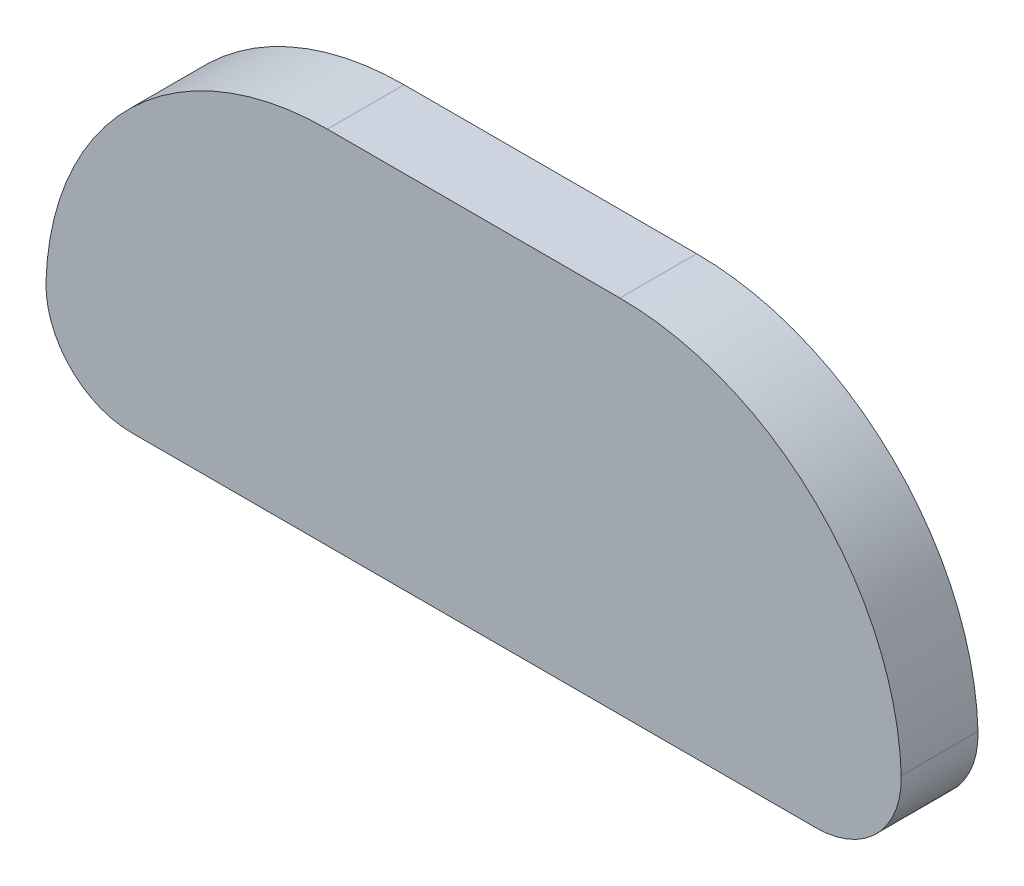
ISO-10303-21;
HEADER;
FILE_DESCRIPTION(('STEP AP214'),'2;1');
FILE_NAME('part.step','',(''),(''),'','','');
FILE_SCHEMA(('AUTOMOTIVE_DESIGN { 1 0 10303 214 1 1 1 1 }'));
ENDSEC;
DATA;
#1=APPLICATION_CONTEXT('core data for automotive mechanical design processes');
#2=APPLICATION_PROTOCOL_DEFINITION('international standard','automotive_design',2000,#1);
#3=PRODUCT_CONTEXT('',#1,'mechanical');
#4=PRODUCT('Part','Part','',(#3));
#5=PRODUCT_RELATED_PRODUCT_CATEGORY('part','',(#4));
#6=PRODUCT_DEFINITION_FORMATION('','',#4);
#7=PRODUCT_DEFINITION_CONTEXT('part definition',#1,'design');
#8=PRODUCT_DEFINITION('design','',#6,#7);
#9=PRODUCT_DEFINITION_SHAPE('','',#8);
#10=(LENGTH_UNIT() NAMED_UNIT(*) SI_UNIT(.MILLI.,.METRE.));
#11=(NAMED_UNIT(*) PLANE_ANGLE_UNIT() SI_UNIT($,.RADIAN.));
#12=(NAMED_UNIT(*) SI_UNIT($,.STERADIAN.) SOLID_ANGLE_UNIT());
#13=UNCERTAINTY_MEASURE_WITH_UNIT(LENGTH_MEASURE(1.E-05),#10,'distance_accuracy_value','');
#14=(GEOMETRIC_REPRESENTATION_CONTEXT(3) GLOBAL_UNCERTAINTY_ASSIGNED_CONTEXT((#13)) GLOBAL_UNIT_ASSIGNED_CONTEXT((#10,
#11,#12)) REPRESENTATION_CONTEXT('',''));
#15=CARTESIAN_POINT('',(0.,0.,0.));
#16=DIRECTION('',(0.,0.,1.));
#17=DIRECTION('',(1.,0.,0.));
#18=AXIS2_PLACEMENT_3D('',#15,#16,#17);
#19=CARTESIAN_POINT('',(0.,10.7088674385958,7.));
#20=DIRECTION('',(0.,1.,0.));
#21=DIRECTION('',(0.,0.,1.));
#22=AXIS2_PLACEMENT_3D('',#19,#20,#21);
#23=PLANE('',#22);
#24=DIRECTION('',(-1.,0.,0.));
#25=VECTOR('',#24,1.);
#26=CARTESIAN_POINT('',(0.,10.7088674385958,9.));
#27=LINE('',#26,#25);
#28=CARTESIAN_POINT('',(17.2373981892601,10.7088674385958,9.));
#29=VERTEX_POINT('',#28);
#30=CARTESIAN_POINT('',(-17.0626018107399,10.7088674385958,9.));
#31=VERTEX_POINT('',#30);
#32=EDGE_CURVE('E169',#29,#31,#27,.T.);
#33=ORIENTED_EDGE('',*,*,#32,.F.);
#34=DIRECTION('',(0.,0.,-1.));
#35=VECTOR('',#34,1.);
#36=CARTESIAN_POINT('',(17.2373981892601,10.7088674385958,7.));
#37=LINE('',#36,#35);
#38=CARTESIAN_POINT('',(17.2373981892601,10.7088674385958,0.));
#39=VERTEX_POINT('',#38);
#40=EDGE_CURVE('E104',#29,#39,#37,.T.);
#41=ORIENTED_EDGE('',*,*,#40,.T.);
#42=DIRECTION('',(1.,0.,0.));
#43=VECTOR('',#42,1.);
#44=CARTESIAN_POINT('',(0.,10.7088674385958,0.));
#45=LINE('',#44,#43);
#46=CARTESIAN_POINT('',(-17.0626018107399,10.7088674385958,0.));
#47=VERTEX_POINT('',#46);
#48=EDGE_CURVE('E99',#47,#39,#45,.T.);
#49=ORIENTED_EDGE('',*,*,#48,.F.);
#50=DIRECTION('',(0.,0.,-1.));
#51=VECTOR('',#50,1.);
#52=CARTESIAN_POINT('',(-17.0626018107399,10.7088674385958,9.));
#53=LINE('',#52,#51);
#54=EDGE_CURVE('E109',#47,#31,#53,.F.);
#55=ORIENTED_EDGE('',*,*,#54,.T.);
#56=EDGE_LOOP('',(#33,#41,#49,#55));
#57=FACE_BOUND('',#56,.T.);
#58=ADVANCED_FACE('F41',(#57),#23,.T.);
#59=CARTESIAN_POINT('',(0.,-31.5911325614042,7.));
#60=DIRECTION('',(0.,1.,0.));
#61=DIRECTION('',(0.,0.,1.));
#62=AXIS2_PLACEMENT_3D('',#59,#60,#61);
#63=PLANE('',#62);
#64=DIRECTION('',(1.,0.,0.));
#65=VECTOR('',#64,1.);
#66=CARTESIAN_POINT('',(0.,-31.5911325614042,0.));
#67=LINE('',#66,#65);
#68=CARTESIAN_POINT('',(-40.0519471689705,-31.5911325614042,0.));
#69=VERTEX_POINT('',#68);
#70=CARTESIAN_POINT('',(40.2267435474907,-31.5911325614042,0.));
#71=VERTEX_POINT('',#70);
#72=EDGE_CURVE('E112',#69,#71,#67,.T.);
#73=ORIENTED_EDGE('',*,*,#72,.T.);
#74=DIRECTION('',(0.,0.,1.));
#75=VECTOR('',#74,1.);
#76=CARTESIAN_POINT('',(40.2267435474907,-31.5911325614042,9.));
#77=LINE('',#76,#75);
#78=CARTESIAN_POINT('',(40.2267435474907,-31.5911325614042,9.));
#79=VERTEX_POINT('',#78);
#80=EDGE_CURVE('E140',#71,#79,#77,.T.);
#81=ORIENTED_EDGE('',*,*,#80,.T.);
#82=DIRECTION('',(-1.,0.,0.));
#83=VECTOR('',#82,1.);
#84=CARTESIAN_POINT('',(0.,-31.5911325614042,9.));
#85=LINE('',#84,#83);
#86=CARTESIAN_POINT('',(-40.0519471689705,-31.5911325614042,9.));
#87=VERTEX_POINT('',#86);
#88=EDGE_CURVE('E145',#79,#87,#85,.T.);
#89=ORIENTED_EDGE('',*,*,#88,.T.);
#90=DIRECTION('',(0.,0.,-1.));
#91=VECTOR('',#90,1.);
#92=CARTESIAN_POINT('',(-40.0519471689705,-31.5911325614042,0.));
#93=LINE('',#92,#91);
#94=EDGE_CURVE('E137',#87,#69,#93,.T.);
#95=ORIENTED_EDGE('',*,*,#94,.T.);
#96=EDGE_LOOP('',(#73,#81,#89,#95));
#97=FACE_BOUND('',#96,.T.);
#98=ADVANCED_FACE('F154',(#97),#63,.F.);
#99=CARTESIAN_POINT('',(-39.9126018107399,-21.4411325614042,7.));
#100=DIRECTION('',(0.,0.,-1.));
#101=DIRECTION('',(-1.,0.,0.));
#102=AXIS2_PLACEMENT_3D('',#99,#100,#101);
#103=CYLINDRICAL_SURFACE('',#102,5.15);
#104=CARTESIAN_POINT('',(-39.9126018107399,-21.4411325614042,7.));
#105=DIRECTION('',(0.,0.,1.));
#106=DIRECTION('',(1.,0.,0.));
#107=AXIS2_PLACEMENT_3D('',#104,#105,#106);
#108=CIRCLE('',#107,5.15);
#109=CARTESIAN_POINT('',(-34.7626018107399,-21.4411325614042,7.));
#110=VERTEX_POINT('',#109);
#111=EDGE_CURVE('E166',#110,#110,#108,.T.);
#112=ORIENTED_EDGE('',*,*,#111,.T.);
#113=EDGE_LOOP('',(#112));
#114=FACE_BOUND('',#113,.T.);
#115=CARTESIAN_POINT('',(-39.9126018107399,-21.4411325614042,0.));
#116=DIRECTION('',(0.,0.,1.));
#117=DIRECTION('',(1.,0.,0.));
#118=AXIS2_PLACEMENT_3D('',#115,#116,#117);
#119=CIRCLE('',#118,5.15);
#120=CARTESIAN_POINT('',(-34.7626018107399,-21.4411325614042,0.));
#121=VERTEX_POINT('',#120);
#122=EDGE_CURVE('E156',#121,#121,#119,.T.);
#123=ORIENTED_EDGE('',*,*,#122,.F.);
#124=EDGE_LOOP('',(#123));
#125=FACE_BOUND('',#124,.T.);
#126=ADVANCED_FACE('F186',(#114,#125),#103,.F.);
#127=CARTESIAN_POINT('',(-16.5085902206154,3.55886743859581,7.));
#128=DIRECTION('',(0.,0.,-1.));
#129=DIRECTION('',(-1.,0.,0.));
#130=AXIS2_PLACEMENT_3D('',#127,#128,#129);
#131=CYLINDRICAL_SURFACE('',#130,5.15);
#132=CARTESIAN_POINT('',(-16.5085902206154,3.55886743859581,7.));
#133=DIRECTION('',(0.,0.,1.));
#134=DIRECTION('',(1.,0.,0.));
#135=AXIS2_PLACEMENT_3D('',#132,#133,#134);
#136=CIRCLE('',#135,5.15);
#137=CARTESIAN_POINT('',(-11.3585902206154,3.55886743859581,7.));
#138=VERTEX_POINT('',#137);
#139=EDGE_CURVE('E164',#138,#138,#136,.T.);
#140=ORIENTED_EDGE('',*,*,#139,.T.);
#141=EDGE_LOOP('',(#140));
#142=FACE_BOUND('',#141,.T.);
#143=CARTESIAN_POINT('',(-16.5085902206154,3.55886743859581,0.));
#144=DIRECTION('',(0.,0.,1.));
#145=DIRECTION('',(1.,0.,0.));
#146=AXIS2_PLACEMENT_3D('',#143,#144,#145);
#147=CIRCLE('',#146,5.15);
#148=CARTESIAN_POINT('',(-11.3585902206154,3.55886743859581,0.));
#149=VERTEX_POINT('',#148);
#150=EDGE_CURVE('E113',#149,#149,#147,.T.);
#151=ORIENTED_EDGE('',*,*,#150,.F.);
#152=EDGE_LOOP('',(#151));
#153=FACE_BOUND('',#152,.T.);
#154=ADVANCED_FACE('F190',(#142,#153),#131,.F.);
#155=CARTESIAN_POINT('',(16.4914097793846,3.55886743859581,7.));
#156=DIRECTION('',(0.,0.,-1.));
#157=DIRECTION('',(-1.,0.,0.));
#158=AXIS2_PLACEMENT_3D('',#155,#156,#157);
#159=CYLINDRICAL_SURFACE('',#158,5.15);
#160=CARTESIAN_POINT('',(16.4914097793846,3.55886743859581,7.));
#161=DIRECTION('',(0.,0.,1.));
#162=DIRECTION('',(1.,0.,0.));
#163=AXIS2_PLACEMENT_3D('',#160,#161,#162);
#164=CIRCLE('',#163,5.15);
#165=CARTESIAN_POINT('',(21.6414097793846,3.55886743859581,7.));
#166=VERTEX_POINT('',#165);
#167=EDGE_CURVE('E121',#166,#166,#164,.F.);
#168=ORIENTED_EDGE('',*,*,#167,.F.);
#169=EDGE_LOOP('',(#168));
#170=FACE_BOUND('',#169,.T.);
#171=CARTESIAN_POINT('',(16.4914097793846,3.55886743859581,0.));
#172=DIRECTION('',(0.,0.,1.));
#173=DIRECTION('',(1.,0.,0.));
#174=AXIS2_PLACEMENT_3D('',#171,#172,#173);
#175=CIRCLE('',#174,5.15);
#176=CARTESIAN_POINT('',(21.6414097793846,3.55886743859581,0.));
#177=VERTEX_POINT('',#176);
#178=EDGE_CURVE('E162',#177,#177,#175,.F.);
#179=ORIENTED_EDGE('',*,*,#178,.T.);
#180=EDGE_LOOP('',(#179));
#181=FACE_BOUND('',#180,.T.);
#182=ADVANCED_FACE('F193',(#170,#181),#159,.F.);
#183=CARTESIAN_POINT('',(40.0873981892601,-21.4411325614042,7.));
#184=DIRECTION('',(0.,0.,-1.));
#185=DIRECTION('',(-1.,0.,0.));
#186=AXIS2_PLACEMENT_3D('',#183,#184,#185);
#187=CYLINDRICAL_SURFACE('',#186,5.15);
#188=CARTESIAN_POINT('',(40.0873981892601,-21.4411325614042,7.));
#189=DIRECTION('',(0.,0.,1.));
#190=DIRECTION('',(1.,0.,0.));
#191=AXIS2_PLACEMENT_3D('',#188,#189,#190);
#192=CIRCLE('',#191,5.15);
#193=CARTESIAN_POINT('',(45.2373981892601,-21.4411325614042,7.));
#194=VERTEX_POINT('',#193);
#195=EDGE_CURVE('E117',#194,#194,#192,.F.);
#196=ORIENTED_EDGE('',*,*,#195,.F.);
#197=EDGE_LOOP('',(#196));
#198=FACE_BOUND('',#197,.T.);
#199=CARTESIAN_POINT('',(40.0873981892601,-21.4411325614042,0.));
#200=DIRECTION('',(0.,0.,1.));
#201=DIRECTION('',(1.,0.,0.));
#202=AXIS2_PLACEMENT_3D('',#199,#200,#201);
#203=CIRCLE('',#202,5.15);
#204=CARTESIAN_POINT('',(45.2373981892601,-21.4411325614042,0.));
#205=VERTEX_POINT('',#204);
#206=EDGE_CURVE('E124',#205,#205,#203,.F.);
#207=ORIENTED_EDGE('',*,*,#206,.T.);
#208=EDGE_LOOP('',(#207));
#209=FACE_BOUND('',#208,.T.);
#210=ADVANCED_FACE('F197',(#198,#209),#187,.F.);
#211=CARTESIAN_POINT('',(0.,0.,0.));
#212=DIRECTION('',(0.,0.,1.));
#213=DIRECTION('',(1.,0.,0.));
#214=AXIS2_PLACEMENT_3D('',#211,#212,#213);
#215=PLANE('',#214);
#216=ORIENTED_EDGE('',*,*,#178,.F.);
#217=EDGE_LOOP('',(#216));
#218=FACE_BOUND('',#217,.T.);
#219=ORIENTED_EDGE('',*,*,#150,.T.);
#220=EDGE_LOOP('',(#219));
#221=FACE_BOUND('',#220,.T.);
#222=CARTESIAN_POINT('',(17.2373981892601,-22.2911325614042,0.));
#223=DIRECTION('',(0.,0.,1.));
#224=DIRECTION('',(1.,0.,0.));
#225=AXIS2_PLACEMENT_3D('',#222,#223,#224);
#226=CIRCLE('',#225,33.);
#227=CARTESIAN_POINT('',(50.2221110945475,-21.2867847353172,0.));
#228=VERTEX_POINT('',#227);
#229=EDGE_CURVE('E103',#39,#228,#226,.F.);
#230=ORIENTED_EDGE('',*,*,#229,.T.);
#231=CARTESIAN_POINT('',(40.2267435474907,-21.5911325614042,0.));
#232=DIRECTION('',(0.,0.,1.));
#233=DIRECTION('',(1.,0.,0.));
#234=AXIS2_PLACEMENT_3D('',#231,#232,#233);
#235=CIRCLE('',#234,10.);
#236=EDGE_CURVE('E135',#228,#71,#235,.F.);
#237=ORIENTED_EDGE('',*,*,#236,.T.);
#238=ORIENTED_EDGE('',*,*,#72,.F.);
#239=CARTESIAN_POINT('',(-40.0519471689705,-21.5911325614042,0.));
#240=DIRECTION('',(0.,0.,1.));
#241=DIRECTION('',(1.,0.,0.));
#242=AXIS2_PLACEMENT_3D('',#239,#240,#241);
#243=CIRCLE('',#242,10.);
#244=CARTESIAN_POINT('',(-50.0473147160273,-21.2867847353172,0.));
#245=VERTEX_POINT('',#244);
#246=EDGE_CURVE('E101',#69,#245,#243,.F.);
#247=ORIENTED_EDGE('',*,*,#246,.T.);
#248=CARTESIAN_POINT('',(-17.0626018107399,-22.2911325614042,0.));
#249=DIRECTION('',(0.,0.,1.));
#250=DIRECTION('',(1.,0.,0.));
#251=AXIS2_PLACEMENT_3D('',#248,#249,#250);
#252=CIRCLE('',#251,33.);
#253=EDGE_CURVE('E94',#245,#47,#252,.F.);
#254=ORIENTED_EDGE('',*,*,#253,.T.);
#255=ORIENTED_EDGE('',*,*,#48,.T.);
#256=EDGE_LOOP('',(#230,#237,#238,#247,#254,#255));
#257=FACE_BOUND('',#256,.T.);
#258=ORIENTED_EDGE('',*,*,#122,.T.);
#259=EDGE_LOOP('',(#258));
#260=FACE_BOUND('',#259,.T.);
#261=ORIENTED_EDGE('',*,*,#206,.F.);
#262=EDGE_LOOP('',(#261));
#263=FACE_BOUND('',#262,.T.);
#264=ADVANCED_FACE('F97',(#218,#221,#257,#260,#263),#215,.F.);
#265=CARTESIAN_POINT('',(0.,0.,7.));
#266=DIRECTION('',(0.,0.,-1.));
#267=DIRECTION('',(-1.,0.,0.));
#268=AXIS2_PLACEMENT_3D('',#265,#266,#267);
#269=PLANE('',#268);
#270=ORIENTED_EDGE('',*,*,#195,.T.);
#271=EDGE_LOOP('',(#270));
#272=FACE_BOUND('',#271,.T.);
#273=ADVANCED_FACE('F247',(#272),#269,.T.);
#274=ORIENTED_EDGE('',*,*,#111,.F.);
#275=EDGE_LOOP('',(#274));
#276=FACE_BOUND('',#275,.T.);
#277=ADVANCED_FACE('F239',(#276),#269,.T.);
#278=ORIENTED_EDGE('',*,*,#139,.F.);
#279=EDGE_LOOP('',(#278));
#280=FACE_BOUND('',#279,.T.);
#281=ADVANCED_FACE('F236',(#280),#269,.T.);
#282=ORIENTED_EDGE('',*,*,#167,.T.);
#283=EDGE_LOOP('',(#282));
#284=FACE_BOUND('',#283,.T.);
#285=ADVANCED_FACE('F229',(#284),#269,.T.);
#286=CARTESIAN_POINT('',(0.,0.,9.));
#287=DIRECTION('',(0.,0.,-1.));
#288=DIRECTION('',(-1.,0.,0.));
#289=AXIS2_PLACEMENT_3D('',#286,#287,#288);
#290=PLANE('',#289);
#291=ORIENTED_EDGE('',*,*,#88,.F.);
#292=CARTESIAN_POINT('',(40.2267435474907,-21.5911325614042,9.));
#293=DIRECTION('',(0.,0.,-1.));
#294=DIRECTION('',(-1.,0.,0.));
#295=AXIS2_PLACEMENT_3D('',#292,#293,#294);
#296=CIRCLE('',#295,10.);
#297=CARTESIAN_POINT('',(50.2221110945475,-21.2867847353172,9.));
#298=VERTEX_POINT('',#297);
#299=EDGE_CURVE('E49',#79,#298,#296,.F.);
#300=ORIENTED_EDGE('',*,*,#299,.T.);
#301=CARTESIAN_POINT('',(17.2373981892601,-22.2911325614042,9.));
#302=DIRECTION('',(0.,0.,-1.));
#303=DIRECTION('',(-1.,0.,0.));
#304=AXIS2_PLACEMENT_3D('',#301,#302,#303);
#305=CIRCLE('',#304,33.);
#306=EDGE_CURVE('E129',#298,#29,#305,.F.);
#307=ORIENTED_EDGE('',*,*,#306,.T.);
#308=ORIENTED_EDGE('',*,*,#32,.T.);
#309=CARTESIAN_POINT('',(-17.0626018107399,-22.2911325614042,9.));
#310=DIRECTION('',(0.,0.,-1.));
#311=DIRECTION('',(-1.,0.,0.));
#312=AXIS2_PLACEMENT_3D('',#309,#310,#311);
#313=CIRCLE('',#312,33.);
#314=CARTESIAN_POINT('',(-50.0473147160273,-21.2867847353172,9.));
#315=VERTEX_POINT('',#314);
#316=EDGE_CURVE('E116',#31,#315,#313,.F.);
#317=ORIENTED_EDGE('',*,*,#316,.T.);
#318=CARTESIAN_POINT('',(-40.0519471689705,-21.5911325614042,9.));
#319=DIRECTION('',(0.,0.,-1.));
#320=DIRECTION('',(-1.,0.,0.));
#321=AXIS2_PLACEMENT_3D('',#318,#319,#320);
#322=CIRCLE('',#321,10.);
#323=EDGE_CURVE('E61',#315,#87,#322,.F.);
#324=ORIENTED_EDGE('',*,*,#323,.T.);
#325=EDGE_LOOP('',(#291,#300,#307,#308,#317,#324));
#326=FACE_BOUND('',#325,.T.);
#327=ADVANCED_FACE('F144',(#326),#290,.F.);
#328=CARTESIAN_POINT('',(17.2373981892601,-22.2911325614042,7.));
#329=DIRECTION('',(0.,0.,-1.));
#330=DIRECTION('',(-1.,0.,0.));
#331=AXIS2_PLACEMENT_3D('',#328,#329,#330);
#332=CYLINDRICAL_SURFACE('',#331,33.);
#333=ORIENTED_EDGE('',*,*,#306,.F.);
#334=DIRECTION('',(0.,0.,-1.));
#335=VECTOR('',#334,1.);
#336=CARTESIAN_POINT('',(50.2221110945475,-21.2867847353172,7.));
#337=LINE('',#336,#335);
#338=EDGE_CURVE('E131',#298,#228,#337,.T.);
#339=ORIENTED_EDGE('',*,*,#338,.T.);
#340=ORIENTED_EDGE('',*,*,#229,.F.);
#341=ORIENTED_EDGE('',*,*,#40,.F.);
#342=EDGE_LOOP('',(#333,#339,#340,#341));
#343=FACE_BOUND('',#342,.T.);
#344=ADVANCED_FACE('F150',(#343),#332,.T.);
#345=CARTESIAN_POINT('',(-17.0626018107399,-22.2911325614042,7.));
#346=DIRECTION('',(0.,0.,1.));
#347=DIRECTION('',(1.,0.,0.));
#348=AXIS2_PLACEMENT_3D('',#345,#346,#347);
#349=CYLINDRICAL_SURFACE('',#348,33.);
#350=ORIENTED_EDGE('',*,*,#253,.F.);
#351=DIRECTION('',(0.,0.,1.));
#352=VECTOR('',#351,1.);
#353=CARTESIAN_POINT('',(-50.0473147160273,-21.2867847353172,7.));
#354=LINE('',#353,#352);
#355=EDGE_CURVE('E11',#245,#315,#354,.T.);
#356=ORIENTED_EDGE('',*,*,#355,.T.);
#357=ORIENTED_EDGE('',*,*,#316,.F.);
#358=ORIENTED_EDGE('',*,*,#54,.F.);
#359=EDGE_LOOP('',(#350,#356,#357,#358));
#360=FACE_BOUND('',#359,.T.);
#361=ADVANCED_FACE('F115',(#360),#349,.T.);
#362=CARTESIAN_POINT('',(40.2267435474907,-21.5911325614042,7.));
#363=DIRECTION('',(0.,0.,-1.));
#364=DIRECTION('',(-1.,0.,0.));
#365=AXIS2_PLACEMENT_3D('',#362,#363,#364);
#366=CYLINDRICAL_SURFACE('',#365,10.);
#367=ORIENTED_EDGE('',*,*,#299,.F.);
#368=ORIENTED_EDGE('',*,*,#80,.F.);
#369=ORIENTED_EDGE('',*,*,#236,.F.);
#370=ORIENTED_EDGE('',*,*,#338,.F.);
#371=EDGE_LOOP('',(#367,#368,#369,#370));
#372=FACE_BOUND('',#371,.T.);
#373=ADVANCED_FACE('F151',(#372),#366,.T.);
#374=CARTESIAN_POINT('',(-40.0519471689705,-21.5911325614042,7.));
#375=DIRECTION('',(0.,0.,1.));
#376=DIRECTION('',(1.,0.,0.));
#377=AXIS2_PLACEMENT_3D('',#374,#375,#376);
#378=CYLINDRICAL_SURFACE('',#377,10.);
#379=ORIENTED_EDGE('',*,*,#323,.F.);
#380=ORIENTED_EDGE('',*,*,#355,.F.);
#381=ORIENTED_EDGE('',*,*,#246,.F.);
#382=ORIENTED_EDGE('',*,*,#94,.F.);
#383=EDGE_LOOP('',(#379,#380,#381,#382));
#384=FACE_BOUND('',#383,.T.);
#385=ADVANCED_FACE('F43',(#384),#378,.T.);
#386=CLOSED_SHELL('',(#58,#98,#126,#154,#182,#210,#264,#273,#277,#281,#285,#327,#344,#361,#373,#385));
#387=MANIFOLD_SOLID_BREP('B2',#386);
#388=ADVANCED_BREP_SHAPE_REPRESENTATION('',(#18,#387),#14);
#389=SHAPE_DEFINITION_REPRESENTATION(#9,#388);
ENDSEC;
END-ISO-10303-21;
